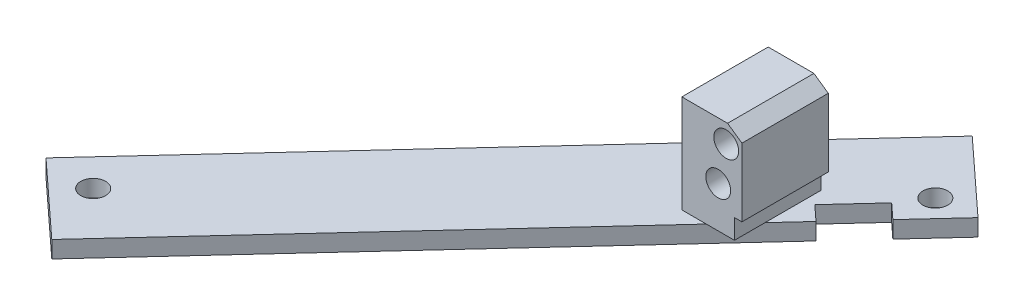
ISO-10303-21;
HEADER;
FILE_DESCRIPTION(('STEP AP214'),'2;1');
FILE_NAME('part.step','',(''),(''),'','','');
FILE_SCHEMA(('AUTOMOTIVE_DESIGN { 1 0 10303 214 1 1 1 1 }'));
ENDSEC;
DATA;
#1=APPLICATION_CONTEXT('core data for automotive mechanical design processes');
#2=APPLICATION_PROTOCOL_DEFINITION('international standard','automotive_design',2000,#1);
#3=PRODUCT_CONTEXT('',#1,'mechanical');
#4=PRODUCT('Part','Part','',(#3));
#5=PRODUCT_RELATED_PRODUCT_CATEGORY('part','',(#4));
#6=PRODUCT_DEFINITION_FORMATION('','',#4);
#7=PRODUCT_DEFINITION_CONTEXT('part definition',#1,'design');
#8=PRODUCT_DEFINITION('design','',#6,#7);
#9=PRODUCT_DEFINITION_SHAPE('','',#8);
#10=(LENGTH_UNIT() NAMED_UNIT(*) SI_UNIT(.MILLI.,.METRE.));
#11=(NAMED_UNIT(*) PLANE_ANGLE_UNIT() SI_UNIT($,.RADIAN.));
#12=(NAMED_UNIT(*) SI_UNIT($,.STERADIAN.) SOLID_ANGLE_UNIT());
#13=UNCERTAINTY_MEASURE_WITH_UNIT(LENGTH_MEASURE(1.E-05),#10,'distance_accuracy_value','');
#14=(GEOMETRIC_REPRESENTATION_CONTEXT(3) GLOBAL_UNCERTAINTY_ASSIGNED_CONTEXT((#13)) GLOBAL_UNIT_ASSIGNED_CONTEXT((#10,
#11,#12)) REPRESENTATION_CONTEXT('',''));
#15=CARTESIAN_POINT('',(0.,0.,0.));
#16=DIRECTION('',(0.,0.,1.));
#17=DIRECTION('',(1.,0.,0.));
#18=AXIS2_PLACEMENT_3D('',#15,#16,#17);
#19=CARTESIAN_POINT('',(-720.470654780454,7.18061443801632,87.1577305714658));
#20=DIRECTION('',(0.735397666391423,0.,0.677635796181141));
#21=DIRECTION('',(-0.677635796181141,0.,0.735397666391423));
#22=AXIS2_PLACEMENT_3D('',#19,#20,#21);
#23=PLANE('',#22);
#24=DIRECTION('',(0.,1.,0.));
#25=VECTOR('',#24,1.);
#26=CARTESIAN_POINT('',(-617.268339259505,193.810760244927,-24.841580013966));
#27=LINE('',#26,#25);
#28=CARTESIAN_POINT('',(-617.268339259505,200.405999999999,-24.841580013966));
#29=VERTEX_POINT('',#28);
#30=CARTESIAN_POINT('',(-617.268339259505,204.732760244927,-24.841580013966));
#31=VERTEX_POINT('',#30);
#32=EDGE_CURVE('E212',#29,#31,#27,.T.);
#33=ORIENTED_EDGE('',*,*,#32,.F.);
#34=DIRECTION('',(-0.677635796181141,0.,0.735397666391423));
#35=VECTOR('',#34,1.);
#36=CARTESIAN_POINT('',(-720.470654780454,200.406,87.1577305714655));
#37=LINE('',#36,#35);
#38=CARTESIAN_POINT('',(-606.819924792596,200.405999999999,-36.180620335858));
#39=VERTEX_POINT('',#38);
#40=EDGE_CURVE('E291',#39,#29,#37,.T.);
#41=ORIENTED_EDGE('',*,*,#40,.F.);
#42=DIRECTION('',(0.,1.,0.));
#43=VECTOR('',#42,1.);
#44=CARTESIAN_POINT('',(-606.819924792595,7.18061443801629,-36.1806203358577));
#45=LINE('',#44,#43);
#46=CARTESIAN_POINT('',(-606.819924792596,204.732760244927,-36.180620335858));
#47=VERTEX_POINT('',#46);
#48=EDGE_CURVE('E267',#39,#47,#45,.T.);
#49=ORIENTED_EDGE('',*,*,#48,.T.);
#50=DIRECTION('',(-0.677635796181141,0.,0.735397666391423));
#51=VECTOR('',#50,1.);
#52=CARTESIAN_POINT('',(-720.470654780454,204.732760244927,87.1577305714655));
#53=LINE('',#52,#51);
#54=EDGE_CURVE('E249',#47,#31,#53,.T.);
#55=ORIENTED_EDGE('',*,*,#54,.T.);
#56=EDGE_LOOP('',(#33,#41,#49,#55));
#57=FACE_BOUND('',#56,.T.);
#58=ADVANCED_FACE('F47',(#57),#23,.T.);
#59=CARTESIAN_POINT('',(-1.17427917548327E-13,204.732760244928,-2.00349036487754E-13));
#60=DIRECTION('',(0.,-1.,0.));
#61=DIRECTION('',(0.,0.,1.));
#62=AXIS2_PLACEMENT_3D('',#59,#60,#61);
#63=PLANE('',#62);
#64=CARTESIAN_POINT('',(-640.158735327476,204.732760244927,0.));
#65=VERTEX_POINT('',#64);
#66=CARTESIAN_POINT('',(-720.470654780454,204.732760244927,87.1577305714655));
#67=VERTEX_POINT('',#66);
#68=EDGE_CURVE('E254',#65,#67,#53,.T.);
#69=ORIENTED_EDGE('',*,*,#68,.F.);
#70=DIRECTION('',(-1.,0.,0.));
#71=VECTOR('',#70,1.);
#72=CARTESIAN_POINT('',(-1.17427917548327E-13,204.732760244928,0.));
#73=LINE('',#72,#71);
#74=CARTESIAN_POINT('',(-646.417262265417,204.732760244927,0.));
#75=VERTEX_POINT('',#74);
#76=EDGE_CURVE('E307',#65,#75,#73,.T.);
#77=ORIENTED_EDGE('',*,*,#76,.T.);
#78=DIRECTION('',(0.,0.,-1.));
#79=VECTOR('',#78,1.);
#80=CARTESIAN_POINT('',(-646.417262265417,204.732760244927,47.2440000000002));
#81=LINE('',#80,#79);
#82=CARTESIAN_POINT('',(-646.417262265417,204.732760244927,-22.0979999999998));
#83=VERTEX_POINT('',#82);
#84=EDGE_CURVE('E193',#75,#83,#81,.T.);
#85=ORIENTED_EDGE('',*,*,#84,.T.);
#86=DIRECTION('',(-1.,0.,0.));
#87=VECTOR('',#86,1.);
#88=CARTESIAN_POINT('',(-602.012710946733,204.732760244927,-22.0979999999998));
#89=LINE('',#88,#87);
#90=CARTESIAN_POINT('',(-632.951817258193,204.732760244927,-22.0979999999998));
#91=VERTEX_POINT('',#90);
#92=EDGE_CURVE('E275',#91,#83,#89,.T.);
#93=ORIENTED_EDGE('',*,*,#92,.F.);
#94=DIRECTION('',(0.,0.,1.));
#95=VECTOR('',#94,1.);
#96=CARTESIAN_POINT('',(-632.951817258193,204.732760244927,-22.0979999999998));
#97=LINE('',#96,#95);
#98=CARTESIAN_POINT('',(-632.951817258193,204.732760244927,-7.82123783881067));
#99=VERTEX_POINT('',#98);
#100=EDGE_CURVE('E224',#91,#99,#97,.T.);
#101=ORIENTED_EDGE('',*,*,#100,.T.);
#102=CARTESIAN_POINT('',(-626.698363279369,204.732760244927,-14.6077380337975));
#103=VERTEX_POINT('',#102);
#104=EDGE_CURVE('E253',#103,#99,#53,.T.);
#105=ORIENTED_EDGE('',*,*,#104,.F.);
#106=DIRECTION('',(-0.735397666391409,0.,-0.677635796181157));
#107=VECTOR('',#106,1.);
#108=CARTESIAN_POINT('',(-626.698363279369,204.732760244927,-14.6077380337975));
#109=LINE('',#108,#107);
#110=CARTESIAN_POINT('',(-630.568702676446,204.732760244927,-18.1740813045057));
#111=VERTEX_POINT('',#110);
#112=EDGE_CURVE('E200',#103,#111,#109,.T.);
#113=ORIENTED_EDGE('',*,*,#112,.T.);
#114=DIRECTION('',(0.677635796181146,0.,-0.735397666391419));
#115=VECTOR('',#114,1.);
#116=CARTESIAN_POINT('',(-630.568702676446,204.732760244927,-18.1740813045057));
#117=LINE('',#116,#115);
#118=CARTESIAN_POINT('',(-621.138678656582,204.732760244927,-28.4079232846741));
#119=VERTEX_POINT('',#118);
#120=EDGE_CURVE('E204',#111,#119,#117,.T.);
#121=ORIENTED_EDGE('',*,*,#120,.T.);
#122=DIRECTION('',(0.73539766639142,0.,0.677635796181144));
#123=VECTOR('',#122,1.);
#124=CARTESIAN_POINT('',(-621.138678656582,204.732760244927,-28.4079232846741));
#125=LINE('',#124,#123);
#126=EDGE_CURVE('E208',#119,#31,#125,.T.);
#127=ORIENTED_EDGE('',*,*,#126,.T.);
#128=ORIENTED_EDGE('',*,*,#54,.F.);
#129=DIRECTION('',(0.735397666391417,0.,0.677635796181148));
#130=VECTOR('',#129,1.);
#131=CARTESIAN_POINT('',(-606.819924792596,204.732760244927,-36.180620335858));
#132=LINE('',#131,#130);
#133=CARTESIAN_POINT('',(-625.633544770746,204.732760244927,-53.516522984967));
#134=VERTEX_POINT('',#133);
#135=EDGE_CURVE('E255',#134,#47,#132,.T.);
#136=ORIENTED_EDGE('',*,*,#135,.F.);
#137=DIRECTION('',(0.677635796181146,0.,-0.735397666391419));
#138=VECTOR('',#137,1.);
#139=CARTESIAN_POINT('',(-625.633544770746,204.732760244927,-53.516522984967));
#140=LINE('',#139,#138);
#141=CARTESIAN_POINT('',(-739.284274758606,204.732760244927,69.8218279223559));
#142=VERTEX_POINT('',#141);
#143=EDGE_CURVE('E258',#142,#134,#140,.T.);
#144=ORIENTED_EDGE('',*,*,#143,.F.);
#145=DIRECTION('',(-0.735397666391419,0.,-0.677635796181146));
#146=VECTOR('',#145,1.);
#147=CARTESIAN_POINT('',(-739.284274758606,204.732760244927,69.8218279223559));
#148=LINE('',#147,#146);
#149=EDGE_CURVE('E244',#67,#142,#148,.T.);
#150=ORIENTED_EDGE('',*,*,#149,.F.);
#151=EDGE_LOOP('',(#69,#77,#85,#93,#101,#105,#113,#121,#127,#128,#136,#144,#150));
#152=FACE_BOUND('',#151,.T.);
#153=CARTESIAN_POINT('',(-726.476877187304,204.732760244927,70.5585665415715));
#154=DIRECTION('',(0.,-1.,0.));
#155=DIRECTION('',(0.,0.,-1.));
#156=AXIS2_PLACEMENT_3D('',#153,#154,#155);
#157=CIRCLE('',#156,3.17500000000008);
#158=CARTESIAN_POINT('',(-726.476877187304,204.732760244927,67.3835665415714));
#159=VERTEX_POINT('',#158);
#160=EDGE_CURVE('E262',#159,#159,#157,.T.);
#161=ORIENTED_EDGE('',*,*,#160,.T.);
#162=EDGE_LOOP('',(#161));
#163=FACE_BOUND('',#162,.T.);
#164=CARTESIAN_POINT('',(-616.617520158039,204.732760244927,-35.0666277688599));
#165=DIRECTION('',(0.,-1.,0.));
#166=DIRECTION('',(0.,0.,-1.));
#167=AXIS2_PLACEMENT_3D('',#164,#165,#166);
#168=CIRCLE('',#167,3.17499999999996);
#169=CARTESIAN_POINT('',(-616.617520158039,204.732760244927,-38.2416277688598));
#170=VERTEX_POINT('',#169);
#171=EDGE_CURVE('E263',#170,#170,#168,.T.);
#172=ORIENTED_EDGE('',*,*,#171,.T.);
#173=EDGE_LOOP('',(#172));
#174=FACE_BOUND('',#173,.T.);
#175=ADVANCED_FACE('F368',(#152,#163,#174),#63,.F.);
#176=CARTESIAN_POINT('',(0.,0.,0.));
#177=DIRECTION('',(0.,0.,1.));
#178=DIRECTION('',(-1.,0.,0.));
#179=AXIS2_PLACEMENT_3D('',#176,#177,#178);
#180=PLANE('',#179);
#181=DIRECTION('',(-0.819152044288988,0.573576436351051,0.));
#182=VECTOR('',#181,1.);
#183=CARTESIAN_POINT('',(-100.850973306038,-144.030116505019,0.));
#184=LINE('',#183,#182);
#185=CARTESIAN_POINT('',(-631.043320926215,227.214561999736,0.));
#186=VERTEX_POINT('',#185);
#187=CARTESIAN_POINT('',(-634.713941760489,229.784758377805,0.));
#188=VERTEX_POINT('',#187);
#189=EDGE_CURVE('E170',#186,#188,#184,.T.);
#190=ORIENTED_EDGE('',*,*,#189,.T.);
#191=DIRECTION('',(-1.,0.,0.));
#192=VECTOR('',#191,1.);
#193=CARTESIAN_POINT('',(-646.417262265417,229.784758377805,0.));
#194=LINE('',#193,#192);
#195=CARTESIAN_POINT('',(-646.417262265417,229.784758377805,0.));
#196=VERTEX_POINT('',#195);
#197=EDGE_CURVE('E167',#188,#196,#194,.T.);
#198=ORIENTED_EDGE('',*,*,#197,.T.);
#199=DIRECTION('',(0.,-1.,0.));
#200=VECTOR('',#199,1.);
#201=CARTESIAN_POINT('',(-646.417262265417,0.,0.));
#202=LINE('',#201,#200);
#203=EDGE_CURVE('E197',#196,#75,#202,.T.);
#204=ORIENTED_EDGE('',*,*,#203,.T.);
#205=ORIENTED_EDGE('',*,*,#76,.F.);
#206=DIRECTION('',(-1.,0.,0.));
#207=VECTOR('',#206,1.);
#208=CARTESIAN_POINT('',(-632.951817258193,204.732760244927,0.));
#209=LINE('',#208,#207);
#210=CARTESIAN_POINT('',(-632.951817258193,204.732760244927,0.));
#211=VERTEX_POINT('',#210);
#212=EDGE_CURVE('E230',#211,#65,#209,.T.);
#213=ORIENTED_EDGE('',*,*,#212,.F.);
#214=DIRECTION('',(0.,-1.,0.));
#215=VECTOR('',#214,1.);
#216=CARTESIAN_POINT('',(-632.951817258193,232.176381810683,0.));
#217=LINE('',#216,#215);
#218=CARTESIAN_POINT('',(-632.951817258193,209.772926257714,0.));
#219=VERTEX_POINT('',#218);
#220=EDGE_CURVE('E234',#219,#211,#217,.T.);
#221=ORIENTED_EDGE('',*,*,#220,.F.);
#222=DIRECTION('',(1.,0.,0.));
#223=VECTOR('',#222,1.);
#224=CARTESIAN_POINT('',(-629.011320926215,209.772926257714,0.));
#225=LINE('',#224,#223);
#226=CARTESIAN_POINT('',(-631.043320926215,209.772926257714,0.));
#227=VERTEX_POINT('',#226);
#228=EDGE_CURVE('E312',#219,#227,#225,.T.);
#229=ORIENTED_EDGE('',*,*,#228,.T.);
#230=DIRECTION('',(0.,1.,0.));
#231=VECTOR('',#230,1.);
#232=CARTESIAN_POINT('',(-631.043320926215,0.,0.));
#233=LINE('',#232,#231);
#234=EDGE_CURVE('E187',#227,#186,#233,.T.);
#235=ORIENTED_EDGE('',*,*,#234,.T.);
#236=EDGE_LOOP('',(#190,#198,#204,#205,#213,#221,#229,#235));
#237=FACE_BOUND('',#236,.T.);
#238=CARTESIAN_POINT('',(-635.053635704384,224.999999999999,0.));
#239=DIRECTION('',(0.,0.,1.));
#240=DIRECTION('',(1.,0.,0.));
#241=AXIS2_PLACEMENT_3D('',#238,#239,#240);
#242=CIRCLE('',#241,3.1750000000002);
#243=CARTESIAN_POINT('',(-638.228635704384,224.999999999999,0.));
#244=VERTEX_POINT('',#243);
#245=EDGE_CURVE('E311',#244,#244,#242,.T.);
#246=ORIENTED_EDGE('',*,*,#245,.F.);
#247=EDGE_LOOP('',(#246));
#248=FACE_BOUND('',#247,.T.);
#249=CARTESIAN_POINT('',(-637.111164230449,215.21396012861,0.));
#250=DIRECTION('',(0.,0.,1.));
#251=DIRECTION('',(1.,0.,0.));
#252=AXIS2_PLACEMENT_3D('',#249,#250,#251);
#253=CIRCLE('',#252,3.17500000000009);
#254=CARTESIAN_POINT('',(-640.286164230449,215.21396012861,0.));
#255=VERTEX_POINT('',#254);
#256=EDGE_CURVE('E321',#255,#255,#253,.T.);
#257=ORIENTED_EDGE('',*,*,#256,.F.);
#258=EDGE_LOOP('',(#257));
#259=FACE_BOUND('',#258,.T.);
#260=ADVANCED_FACE('F375',(#237,#248,#259),#180,.T.);
#261=CARTESIAN_POINT('',(-602.012710946733,222.838262989788,-22.0979999999998));
#262=DIRECTION('',(0.,0.,1.));
#263=DIRECTION('',(-1.,0.,0.));
#264=AXIS2_PLACEMENT_3D('',#261,#262,#263);
#265=PLANE('',#264);
#266=CARTESIAN_POINT('',(-635.053635704384,224.999999999999,-22.0979999999998));
#267=DIRECTION('',(0.,0.,-1.));
#268=DIRECTION('',(-1.,0.,0.));
#269=AXIS2_PLACEMENT_3D('',#266,#267,#268);
#270=CIRCLE('',#269,3.1750000000002);
#271=CARTESIAN_POINT('',(-638.228635704384,224.999999999999,-22.0979999999998));
#272=VERTEX_POINT('',#271);
#273=EDGE_CURVE('E331',#272,#272,#270,.T.);
#274=ORIENTED_EDGE('',*,*,#273,.F.);
#275=EDGE_LOOP('',(#274));
#276=FACE_BOUND('',#275,.T.);
#277=CARTESIAN_POINT('',(-637.111164230449,215.21396012861,-22.0979999999998));
#278=DIRECTION('',(0.,0.,-1.));
#279=DIRECTION('',(-1.,0.,0.));
#280=AXIS2_PLACEMENT_3D('',#277,#278,#279);
#281=CIRCLE('',#280,3.17500000000009);
#282=CARTESIAN_POINT('',(-640.286164230449,215.21396012861,-22.0979999999998));
#283=VERTEX_POINT('',#282);
#284=EDGE_CURVE('E316',#283,#283,#281,.T.);
#285=ORIENTED_EDGE('',*,*,#284,.F.);
#286=EDGE_LOOP('',(#285));
#287=FACE_BOUND('',#286,.T.);
#288=DIRECTION('',(0.,-1.,0.));
#289=VECTOR('',#288,1.);
#290=CARTESIAN_POINT('',(-631.043320926215,229.784758377805,-22.0979999999998));
#291=LINE('',#290,#289);
#292=CARTESIAN_POINT('',(-631.043320926215,227.214561999736,-22.0979999999998));
#293=VERTEX_POINT('',#292);
#294=CARTESIAN_POINT('',(-631.043320926215,209.772926257714,-22.0979999999998));
#295=VERTEX_POINT('',#294);
#296=EDGE_CURVE('E458',#293,#295,#291,.T.);
#297=ORIENTED_EDGE('',*,*,#296,.T.);
#298=DIRECTION('',(-1.,0.,0.));
#299=VECTOR('',#298,1.);
#300=CARTESIAN_POINT('',(-629.011320926215,209.772926257714,-22.0979999999998));
#301=LINE('',#300,#299);
#302=CARTESIAN_POINT('',(-632.951817258193,209.772926257714,-22.0979999999998));
#303=VERTEX_POINT('',#302);
#304=EDGE_CURVE('E325',#295,#303,#301,.T.);
#305=ORIENTED_EDGE('',*,*,#304,.T.);
#306=DIRECTION('',(0.,-1.,0.));
#307=VECTOR('',#306,1.);
#308=CARTESIAN_POINT('',(-632.951817258193,232.176381810683,-22.0979999999998));
#309=LINE('',#308,#307);
#310=EDGE_CURVE('E216',#303,#91,#309,.T.);
#311=ORIENTED_EDGE('',*,*,#310,.T.);
#312=ORIENTED_EDGE('',*,*,#92,.T.);
#313=DIRECTION('',(0.,1.,0.));
#314=VECTOR('',#313,1.);
#315=CARTESIAN_POINT('',(-646.417262265417,232.174381810683,-22.0979999999998));
#316=LINE('',#315,#314);
#317=CARTESIAN_POINT('',(-646.417262265417,229.784758377805,-22.0979999999998));
#318=VERTEX_POINT('',#317);
#319=EDGE_CURVE('E180',#83,#318,#316,.T.);
#320=ORIENTED_EDGE('',*,*,#319,.T.);
#321=DIRECTION('',(1.,0.,0.));
#322=VECTOR('',#321,1.);
#323=CARTESIAN_POINT('',(-646.417262265417,229.784758377805,-22.0979999999998));
#324=LINE('',#323,#322);
#325=CARTESIAN_POINT('',(-634.713941760489,229.784758377805,-22.0979999999998));
#326=VERTEX_POINT('',#325);
#327=EDGE_CURVE('E164',#318,#326,#324,.T.);
#328=ORIENTED_EDGE('',*,*,#327,.T.);
#329=DIRECTION('',(0.819152044288988,-0.573576436351051,0.));
#330=VECTOR('',#329,1.);
#331=CARTESIAN_POINT('',(-634.713941760489,229.784758377805,-22.0979999999998));
#332=LINE('',#331,#330);
#333=EDGE_CURVE('E171',#326,#293,#332,.T.);
#334=ORIENTED_EDGE('',*,*,#333,.T.);
#335=EDGE_LOOP('',(#297,#305,#311,#312,#320,#328,#334));
#336=FACE_BOUND('',#335,.T.);
#337=ADVANCED_FACE('F49',(#276,#287,#336),#265,.F.);
#338=CARTESIAN_POINT('',(-629.011320926215,209.772926257714,-53.0414259923048));
#339=DIRECTION('',(0.,1.,0.));
#340=DIRECTION('',(0.,0.,-1.));
#341=AXIS2_PLACEMENT_3D('',#338,#339,#340);
#342=PLANE('',#341);
#343=ORIENTED_EDGE('',*,*,#228,.F.);
#344=DIRECTION('',(0.,0.,1.));
#345=VECTOR('',#344,1.);
#346=CARTESIAN_POINT('',(-632.951817258193,209.772926257714,-53.0414259923048));
#347=LINE('',#346,#345);
#348=EDGE_CURVE('E317',#303,#219,#347,.T.);
#349=ORIENTED_EDGE('',*,*,#348,.F.);
#350=ORIENTED_EDGE('',*,*,#304,.F.);
#351=DIRECTION('',(0.,0.,-1.));
#352=VECTOR('',#351,1.);
#353=CARTESIAN_POINT('',(-631.043320926215,209.772926257714,18.0340000000002));
#354=LINE('',#353,#352);
#355=EDGE_CURVE('E452',#227,#295,#354,.T.);
#356=ORIENTED_EDGE('',*,*,#355,.F.);
#357=EDGE_LOOP('',(#343,#349,#350,#356));
#358=FACE_BOUND('',#357,.T.);
#359=ADVANCED_FACE('F440',(#358),#342,.F.);
#360=CARTESIAN_POINT('',(-635.053635704384,224.999999999999,-53.0414259923048));
#361=DIRECTION('',(0.,0.,1.));
#362=DIRECTION('',(-1.,0.,0.));
#363=AXIS2_PLACEMENT_3D('',#360,#361,#362);
#364=CYLINDRICAL_SURFACE('',#363,3.1750000000002);
#365=CARTESIAN_POINT('',(-638.228635704384,224.999999999999,-22.0979999999998));
#366=CARTESIAN_POINT('',(-638.228635704384,224.999999999999,-21.8678124999998));
#367=CARTESIAN_POINT('',(-638.228635704384,224.999999999999,-21.6376249999998));
#368=CARTESIAN_POINT('',(-638.228635704384,224.999999999999,-21.1772499999998));
#369=CARTESIAN_POINT('',(-638.228635704384,224.999999999999,-20.9470624999998));
#370=CARTESIAN_POINT('',(-638.228635704384,224.999999999999,-20.4866874999998));
#371=CARTESIAN_POINT('',(-638.228635704384,224.999999999999,-20.2564999999998));
#372=CARTESIAN_POINT('',(-638.228635704384,224.999999999999,-19.7961249999998));
#373=CARTESIAN_POINT('',(-638.228635704384,224.999999999999,-19.5659374999998));
#374=CARTESIAN_POINT('',(-638.228635704384,224.999999999999,-19.1055624999998));
#375=CARTESIAN_POINT('',(-638.228635704384,224.999999999999,-18.8753749999998));
#376=CARTESIAN_POINT('',(-638.228635704384,224.999999999999,-18.4149999999998));
#377=CARTESIAN_POINT('',(-638.228635704384,224.999999999999,-18.1848124999998));
#378=CARTESIAN_POINT('',(-638.228635704384,224.999999999999,-17.7244374999998));
#379=CARTESIAN_POINT('',(-638.228635704384,224.999999999999,-17.4942499999998));
#380=CARTESIAN_POINT('',(-638.228635704384,224.999999999999,-17.0338749999998));
#381=CARTESIAN_POINT('',(-638.228635704384,224.999999999999,-16.8036874999998));
#382=CARTESIAN_POINT('',(-638.228635704384,224.999999999999,-16.3433124999998));
#383=CARTESIAN_POINT('',(-638.228635704384,224.999999999999,-16.1131249999998));
#384=CARTESIAN_POINT('',(-638.228635704384,224.999999999999,-15.6527499999998));
#385=CARTESIAN_POINT('',(-638.228635704384,224.999999999999,-15.4225624999998));
#386=CARTESIAN_POINT('',(-638.228635704384,224.999999999999,-14.9621874999998));
#387=CARTESIAN_POINT('',(-638.228635704384,224.999999999999,-14.7319999999998));
#388=CARTESIAN_POINT('',(-638.228635704384,224.999999999999,-14.2716249999998));
#389=CARTESIAN_POINT('',(-638.228635704384,224.999999999999,-14.0414374999998));
#390=CARTESIAN_POINT('',(-638.228635704384,224.999999999999,-13.5810624999999));
#391=CARTESIAN_POINT('',(-638.228635704384,224.999999999999,-13.3508749999999));
#392=CARTESIAN_POINT('',(-638.228635704384,224.999999999999,-12.8904999999999));
#393=CARTESIAN_POINT('',(-638.228635704384,224.999999999999,-12.6603124999999));
#394=CARTESIAN_POINT('',(-638.228635704384,224.999999999999,-12.1999374999999));
#395=CARTESIAN_POINT('',(-638.228635704384,224.999999999999,-11.9697499999999));
#396=CARTESIAN_POINT('',(-638.228635704384,224.999999999999,-11.5093749999999));
#397=CARTESIAN_POINT('',(-638.228635704384,224.999999999999,-11.2791874999999));
#398=CARTESIAN_POINT('',(-638.228635704384,224.999999999999,-10.8188124999999));
#399=CARTESIAN_POINT('',(-638.228635704384,224.999999999999,-10.5886249999999));
#400=CARTESIAN_POINT('',(-638.228635704384,224.999999999999,-10.1282499999999));
#401=CARTESIAN_POINT('',(-638.228635704384,224.999999999999,-9.8980624999999));
#402=CARTESIAN_POINT('',(-638.228635704384,224.999999999999,-9.4376874999999));
#403=CARTESIAN_POINT('',(-638.228635704384,224.999999999999,-9.2074999999999));
#404=CARTESIAN_POINT('',(-638.228635704384,224.999999999999,-8.74712499999991));
#405=CARTESIAN_POINT('',(-638.228635704384,224.999999999999,-8.51693749999991));
#406=CARTESIAN_POINT('',(-638.228635704384,224.999999999999,-8.05656249999991));
#407=CARTESIAN_POINT('',(-638.228635704384,224.999999999999,-7.82637499999992));
#408=CARTESIAN_POINT('',(-638.228635704384,224.999999999999,-7.36599999999992));
#409=CARTESIAN_POINT('',(-638.228635704384,224.999999999999,-7.13581249999993));
#410=CARTESIAN_POINT('',(-638.228635704384,224.999999999999,-6.67543749999993));
#411=CARTESIAN_POINT('',(-638.228635704384,224.999999999999,-6.44524999999993));
#412=CARTESIAN_POINT('',(-638.228635704384,224.999999999999,-5.98487499999994));
#413=CARTESIAN_POINT('',(-638.228635704384,224.999999999999,-5.75468749999994));
#414=CARTESIAN_POINT('',(-638.228635704384,224.999999999999,-5.29431249999995));
#415=CARTESIAN_POINT('',(-638.228635704384,224.999999999999,-5.06412499999995));
#416=CARTESIAN_POINT('',(-638.228635704384,224.999999999999,-4.60374999999995));
#417=CARTESIAN_POINT('',(-638.228635704384,224.999999999999,-4.37356249999995));
#418=CARTESIAN_POINT('',(-638.228635704384,224.999999999999,-3.91318749999996));
#419=CARTESIAN_POINT('',(-638.228635704384,224.999999999999,-3.68299999999996));
#420=CARTESIAN_POINT('',(-638.228635704384,224.999999999999,-3.22262499999997));
#421=CARTESIAN_POINT('',(-638.228635704384,224.999999999999,-2.99243749999997));
#422=CARTESIAN_POINT('',(-638.228635704384,224.999999999999,-2.53206249999998));
#423=CARTESIAN_POINT('',(-638.228635704384,224.999999999999,-2.30187499999998));
#424=CARTESIAN_POINT('',(-638.228635704384,224.999999999999,-1.84149999999998));
#425=CARTESIAN_POINT('',(-638.228635704384,224.999999999999,-1.61131249999999));
#426=CARTESIAN_POINT('',(-638.228635704384,224.999999999999,-1.15093749999999));
#427=CARTESIAN_POINT('',(-638.228635704384,224.999999999999,-0.920749999999996));
#428=CARTESIAN_POINT('',(-638.228635704384,224.999999999999,-0.460375000000001));
#429=CARTESIAN_POINT('',(-638.228635704384,224.999999999999,-0.230187500000004));
#430=CARTESIAN_POINT('',(-638.228635704384,224.999999999999,0.));
#431=B_SPLINE_CURVE_WITH_KNOTS('',3,(#365,#366,#367,#368,#369,#370,#371,#372,#373,#374,#375,
#376,#377,#378,#379,#380,#381,#382,#383,#384,#385,#386,#387,#388,#389,#390,#391,#392,#393,#394,
#395,#396,#397,#398,#399,#400,#401,#402,#403,#404,#405,#406,#407,#408,#409,#410,#411,#412,#413,
#414,#415,#416,#417,#418,#419,#420,#421,#422,#423,#424,#425,#426,#427,#428,#429,#430),
.UNSPECIFIED.,.F.,.F.,(4,2,2,2,2,2,2,2,2,2,2,2,2,2,2,2,2,2,2,2,2,2,2,2,2,2,2,2,2,2,2,2,4),(0.,
0.690562499999988,1.38112499999998,2.07168749999997,2.76224999999996,3.45281249999996,
4.14337499999995,4.83393749999994,5.52449999999994,6.21506249999993,6.90562499999992,
7.59618749999991,8.2867499999999,8.97731249999989,9.66787499999988,10.3584374999999,
11.0489999999999,11.7395624999999,12.4301249999999,13.1206874999998,13.8112499999998,
14.5018124999998,15.1923749999998,15.8829374999998,16.5734999999998,17.2640624999998,
17.9546249999998,18.6451874999998,19.3357499999998,20.0263124999998,20.7168749999998,
21.4074374999998,22.0979999999997),.UNSPECIFIED.);
#432=EDGE_CURVE('BSEAM422',#272,#244,#431,.T.);
#433=ORIENTED_EDGE('',*,*,#273,.T.);
#434=ORIENTED_EDGE('',*,*,#245,.T.);
#435=ORIENTED_EDGE('',*,*,#432,.T.);
#436=ORIENTED_EDGE('',*,*,#432,.F.);
#437=EDGE_LOOP('',(#433,#435,#434,#436));
#438=FACE_BOUND('',#437,.T.);
#439=ADVANCED_FACE('F422',(#438),#364,.F.);
#440=CARTESIAN_POINT('',(-637.111164230449,215.21396012861,-53.0414259923048));
#441=DIRECTION('',(0.,0.,1.));
#442=DIRECTION('',(-1.,0.,0.));
#443=AXIS2_PLACEMENT_3D('',#440,#441,#442);
#444=CYLINDRICAL_SURFACE('',#443,3.17500000000009);
#445=CARTESIAN_POINT('',(-640.286164230449,215.21396012861,-22.0979999999998));
#446=CARTESIAN_POINT('',(-640.286164230449,215.21396012861,-21.8678124999998));
#447=CARTESIAN_POINT('',(-640.286164230449,215.21396012861,-21.6376249999998));
#448=CARTESIAN_POINT('',(-640.286164230449,215.21396012861,-21.1772499999998));
#449=CARTESIAN_POINT('',(-640.286164230449,215.21396012861,-20.9470624999998));
#450=CARTESIAN_POINT('',(-640.286164230449,215.21396012861,-20.4866874999998));
#451=CARTESIAN_POINT('',(-640.286164230449,215.21396012861,-20.2564999999998));
#452=CARTESIAN_POINT('',(-640.286164230449,215.21396012861,-19.7961249999998));
#453=CARTESIAN_POINT('',(-640.286164230449,215.21396012861,-19.5659374999998));
#454=CARTESIAN_POINT('',(-640.286164230449,215.21396012861,-19.1055624999998));
#455=CARTESIAN_POINT('',(-640.286164230449,215.21396012861,-18.8753749999998));
#456=CARTESIAN_POINT('',(-640.286164230449,215.21396012861,-18.4149999999998));
#457=CARTESIAN_POINT('',(-640.286164230449,215.21396012861,-18.1848124999998));
#458=CARTESIAN_POINT('',(-640.286164230449,215.21396012861,-17.7244374999998));
#459=CARTESIAN_POINT('',(-640.286164230449,215.21396012861,-17.4942499999998));
#460=CARTESIAN_POINT('',(-640.286164230449,215.21396012861,-17.0338749999998));
#461=CARTESIAN_POINT('',(-640.286164230449,215.21396012861,-16.8036874999998));
#462=CARTESIAN_POINT('',(-640.286164230449,215.21396012861,-16.3433124999998));
#463=CARTESIAN_POINT('',(-640.286164230449,215.21396012861,-16.1131249999998));
#464=CARTESIAN_POINT('',(-640.286164230449,215.21396012861,-15.6527499999998));
#465=CARTESIAN_POINT('',(-640.286164230449,215.21396012861,-15.4225624999998));
#466=CARTESIAN_POINT('',(-640.286164230449,215.21396012861,-14.9621874999998));
#467=CARTESIAN_POINT('',(-640.286164230449,215.21396012861,-14.7319999999998));
#468=CARTESIAN_POINT('',(-640.286164230449,215.21396012861,-14.2716249999998));
#469=CARTESIAN_POINT('',(-640.286164230449,215.21396012861,-14.0414374999998));
#470=CARTESIAN_POINT('',(-640.286164230449,215.21396012861,-13.5810624999999));
#471=CARTESIAN_POINT('',(-640.286164230449,215.21396012861,-13.3508749999999));
#472=CARTESIAN_POINT('',(-640.286164230449,215.21396012861,-12.8904999999999));
#473=CARTESIAN_POINT('',(-640.286164230449,215.21396012861,-12.6603124999999));
#474=CARTESIAN_POINT('',(-640.286164230449,215.21396012861,-12.1999374999999));
#475=CARTESIAN_POINT('',(-640.286164230449,215.21396012861,-11.9697499999999));
#476=CARTESIAN_POINT('',(-640.286164230449,215.21396012861,-11.5093749999999));
#477=CARTESIAN_POINT('',(-640.286164230449,215.21396012861,-11.2791874999999));
#478=CARTESIAN_POINT('',(-640.286164230449,215.21396012861,-10.8188124999999));
#479=CARTESIAN_POINT('',(-640.286164230449,215.21396012861,-10.5886249999999));
#480=CARTESIAN_POINT('',(-640.286164230449,215.21396012861,-10.1282499999999));
#481=CARTESIAN_POINT('',(-640.286164230449,215.21396012861,-9.8980624999999));
#482=CARTESIAN_POINT('',(-640.286164230449,215.21396012861,-9.4376874999999));
#483=CARTESIAN_POINT('',(-640.286164230449,215.21396012861,-9.2074999999999));
#484=CARTESIAN_POINT('',(-640.286164230449,215.21396012861,-8.74712499999991));
#485=CARTESIAN_POINT('',(-640.286164230449,215.21396012861,-8.51693749999991));
#486=CARTESIAN_POINT('',(-640.286164230449,215.21396012861,-8.05656249999991));
#487=CARTESIAN_POINT('',(-640.286164230449,215.21396012861,-7.82637499999992));
#488=CARTESIAN_POINT('',(-640.286164230449,215.21396012861,-7.36599999999992));
#489=CARTESIAN_POINT('',(-640.286164230449,215.21396012861,-7.13581249999993));
#490=CARTESIAN_POINT('',(-640.286164230449,215.21396012861,-6.67543749999993));
#491=CARTESIAN_POINT('',(-640.286164230449,215.21396012861,-6.44524999999993));
#492=CARTESIAN_POINT('',(-640.286164230449,215.21396012861,-5.98487499999994));
#493=CARTESIAN_POINT('',(-640.286164230449,215.21396012861,-5.75468749999994));
#494=CARTESIAN_POINT('',(-640.286164230449,215.21396012861,-5.29431249999995));
#495=CARTESIAN_POINT('',(-640.286164230449,215.21396012861,-5.06412499999995));
#496=CARTESIAN_POINT('',(-640.286164230449,215.21396012861,-4.60374999999995));
#497=CARTESIAN_POINT('',(-640.286164230449,215.21396012861,-4.37356249999995));
#498=CARTESIAN_POINT('',(-640.286164230449,215.21396012861,-3.91318749999996));
#499=CARTESIAN_POINT('',(-640.286164230449,215.21396012861,-3.68299999999996));
#500=CARTESIAN_POINT('',(-640.286164230449,215.21396012861,-3.22262499999997));
#501=CARTESIAN_POINT('',(-640.286164230449,215.21396012861,-2.99243749999997));
#502=CARTESIAN_POINT('',(-640.286164230449,215.21396012861,-2.53206249999998));
#503=CARTESIAN_POINT('',(-640.286164230449,215.21396012861,-2.30187499999998));
#504=CARTESIAN_POINT('',(-640.286164230449,215.21396012861,-1.84149999999998));
#505=CARTESIAN_POINT('',(-640.286164230449,215.21396012861,-1.61131249999999));
#506=CARTESIAN_POINT('',(-640.286164230449,215.21396012861,-1.15093749999999));
#507=CARTESIAN_POINT('',(-640.286164230449,215.21396012861,-0.920749999999996));
#508=CARTESIAN_POINT('',(-640.286164230449,215.21396012861,-0.460375000000001));
#509=CARTESIAN_POINT('',(-640.286164230449,215.21396012861,-0.230187500000004));
#510=CARTESIAN_POINT('',(-640.286164230449,215.21396012861,0.));
#511=B_SPLINE_CURVE_WITH_KNOTS('',3,(#445,#446,#447,#448,#449,#450,#451,#452,#453,#454,#455,
#456,#457,#458,#459,#460,#461,#462,#463,#464,#465,#466,#467,#468,#469,#470,#471,#472,#473,#474,
#475,#476,#477,#478,#479,#480,#481,#482,#483,#484,#485,#486,#487,#488,#489,#490,#491,#492,#493,
#494,#495,#496,#497,#498,#499,#500,#501,#502,#503,#504,#505,#506,#507,#508,#509,#510),
.UNSPECIFIED.,.F.,.F.,(4,2,2,2,2,2,2,2,2,2,2,2,2,2,2,2,2,2,2,2,2,2,2,2,2,2,2,2,2,2,2,2,4),(0.,
0.690562499999988,1.38112499999998,2.07168749999997,2.76224999999996,3.45281249999996,
4.14337499999995,4.83393749999994,5.52449999999994,6.21506249999993,6.90562499999992,
7.59618749999991,8.2867499999999,8.97731249999989,9.66787499999988,10.3584374999999,
11.0489999999999,11.7395624999999,12.4301249999999,13.1206874999998,13.8112499999998,
14.5018124999998,15.1923749999998,15.8829374999998,16.5734999999998,17.2640624999998,
17.9546249999998,18.6451874999998,19.3357499999998,20.0263124999998,20.7168749999998,
21.4074374999998,22.0979999999997),.UNSPECIFIED.);
#512=EDGE_CURVE('BSEAM417',#283,#255,#511,.T.);
#513=ORIENTED_EDGE('',*,*,#284,.T.);
#514=ORIENTED_EDGE('',*,*,#256,.T.);
#515=ORIENTED_EDGE('',*,*,#512,.T.);
#516=ORIENTED_EDGE('',*,*,#512,.F.);
#517=EDGE_LOOP('',(#513,#515,#514,#516));
#518=FACE_BOUND('',#517,.T.);
#519=ADVANCED_FACE('F417',(#518),#444,.F.);
#520=CARTESIAN_POINT('',(-625.633544770746,7.18061443801624,-53.5165229849667));
#521=DIRECTION('',(-0.735397666391419,0.,-0.677635796181146));
#522=DIRECTION('',(0.677635796181146,0.,-0.735397666391419));
#523=AXIS2_PLACEMENT_3D('',#520,#521,#522);
#524=PLANE('',#523);
#525=DIRECTION('',(0.,1.,0.));
#526=VECTOR('',#525,1.);
#527=CARTESIAN_POINT('',(-739.284274758605,7.18061443801629,69.8218279223562));
#528=LINE('',#527,#526);
#529=CARTESIAN_POINT('',(-739.284274758606,200.405999999999,69.8218279223559));
#530=VERTEX_POINT('',#529);
#531=EDGE_CURVE('E290',#530,#142,#528,.T.);
#532=ORIENTED_EDGE('',*,*,#531,.T.);
#533=ORIENTED_EDGE('',*,*,#143,.T.);
#534=DIRECTION('',(0.,1.,0.));
#535=VECTOR('',#534,1.);
#536=CARTESIAN_POINT('',(-625.633544770746,7.18061443801624,-53.5165229849667));
#537=LINE('',#536,#535);
#538=CARTESIAN_POINT('',(-625.633544770746,200.405999999999,-53.516522984967));
#539=VERTEX_POINT('',#538);
#540=EDGE_CURVE('E286',#539,#134,#537,.T.);
#541=ORIENTED_EDGE('',*,*,#540,.F.);
#542=DIRECTION('',(0.677635796181146,0.,-0.735397666391419));
#543=VECTOR('',#542,1.);
#544=CARTESIAN_POINT('',(-625.633544770746,200.405999999999,-53.516522984967));
#545=LINE('',#544,#543);
#546=EDGE_CURVE('E243',#530,#539,#545,.T.);
#547=ORIENTED_EDGE('',*,*,#546,.F.);
#548=EDGE_LOOP('',(#532,#533,#541,#547));
#549=FACE_BOUND('',#548,.T.);
#550=ADVANCED_FACE('F390',(#549),#524,.T.);
#551=CARTESIAN_POINT('',(-739.284274758605,7.18061443801629,69.8218279223562));
#552=DIRECTION('',(-0.677635796181146,0.,0.735397666391419));
#553=DIRECTION('',(-0.735397666391419,0.,-0.677635796181146));
#554=AXIS2_PLACEMENT_3D('',#551,#552,#553);
#555=PLANE('',#554);
#556=DIRECTION('',(0.,1.,0.));
#557=VECTOR('',#556,1.);
#558=CARTESIAN_POINT('',(-720.470654780454,7.18061443801632,87.1577305714658));
#559=LINE('',#558,#557);
#560=CARTESIAN_POINT('',(-720.470654780455,200.406,87.1577305714658));
#561=VERTEX_POINT('',#560);
#562=EDGE_CURVE('E282',#561,#67,#559,.T.);
#563=ORIENTED_EDGE('',*,*,#562,.T.);
#564=ORIENTED_EDGE('',*,*,#149,.T.);
#565=ORIENTED_EDGE('',*,*,#531,.F.);
#566=DIRECTION('',(-0.735397666391419,0.,-0.677635796181146));
#567=VECTOR('',#566,1.);
#568=CARTESIAN_POINT('',(-739.284274758606,200.405999999999,69.8218279223559));
#569=LINE('',#568,#567);
#570=EDGE_CURVE('E287',#561,#530,#569,.T.);
#571=ORIENTED_EDGE('',*,*,#570,.F.);
#572=EDGE_LOOP('',(#563,#564,#565,#571));
#573=FACE_BOUND('',#572,.T.);
#574=ADVANCED_FACE('F382',(#573),#555,.T.);
#575=DIRECTION('',(0.,1.,0.));
#576=VECTOR('',#575,1.);
#577=CARTESIAN_POINT('',(-626.698363279369,193.810760244927,-14.6077380337975));
#578=LINE('',#577,#576);
#579=CARTESIAN_POINT('',(-626.698363279369,200.405999999999,-14.6077380337975));
#580=VERTEX_POINT('',#579);
#581=EDGE_CURVE('E211',#580,#103,#578,.T.);
#582=ORIENTED_EDGE('',*,*,#581,.T.);
#583=ORIENTED_EDGE('',*,*,#104,.T.);
#584=DIRECTION('',(0.677635796181141,0.,-0.735397666391423));
#585=VECTOR('',#584,1.);
#586=CARTESIAN_POINT('',(-720.470654780455,204.732760244927,87.1577305714656));
#587=LINE('',#586,#585);
#588=EDGE_CURVE('E228',#65,#99,#587,.T.);
#589=ORIENTED_EDGE('',*,*,#588,.F.);
#590=ORIENTED_EDGE('',*,*,#68,.T.);
#591=ORIENTED_EDGE('',*,*,#562,.F.);
#592=EDGE_CURVE('E295',#580,#561,#37,.T.);
#593=ORIENTED_EDGE('',*,*,#592,.F.);
#594=EDGE_LOOP('',(#582,#583,#589,#590,#591,#593));
#595=FACE_BOUND('',#594,.T.);
#596=ADVANCED_FACE('F371',(#595),#23,.T.);
#597=CARTESIAN_POINT('',(-606.819924792595,7.18061443801629,-36.1806203358577));
#598=DIRECTION('',(0.677635796181148,0.,-0.735397666391417));
#599=DIRECTION('',(0.735397666391417,0.,0.677635796181148));
#600=AXIS2_PLACEMENT_3D('',#597,#598,#599);
#601=PLANE('',#600);
#602=ORIENTED_EDGE('',*,*,#540,.T.);
#603=ORIENTED_EDGE('',*,*,#135,.T.);
#604=ORIENTED_EDGE('',*,*,#48,.F.);
#605=DIRECTION('',(0.735397666391417,0.,0.677635796181148));
#606=VECTOR('',#605,1.);
#607=CARTESIAN_POINT('',(-606.819924792596,200.405999999999,-36.180620335858));
#608=LINE('',#607,#606);
#609=EDGE_CURVE('E279',#539,#39,#608,.T.);
#610=ORIENTED_EDGE('',*,*,#609,.F.);
#611=EDGE_LOOP('',(#602,#603,#604,#610));
#612=FACE_BOUND('',#611,.T.);
#613=ADVANCED_FACE('F381',(#612),#601,.T.);
#614=CARTESIAN_POINT('',(-616.617520158039,7.18061443801626,-35.0666277688596));
#615=DIRECTION('',(0.,1.,0.));
#616=DIRECTION('',(0.,0.,-1.));
#617=AXIS2_PLACEMENT_3D('',#614,#615,#616);
#618=CYLINDRICAL_SURFACE('',#617,3.17499999999996);
#619=ORIENTED_EDGE('',*,*,#171,.F.);
#620=EDGE_LOOP('',(#619));
#621=FACE_BOUND('',#620,.T.);
#622=CARTESIAN_POINT('',(-616.617520158039,200.405999999999,-35.0666277688599));
#623=DIRECTION('',(0.,1.,0.));
#624=DIRECTION('',(0.,0.,1.));
#625=AXIS2_PLACEMENT_3D('',#622,#623,#624);
#626=CIRCLE('',#625,3.17499999999996);
#627=CARTESIAN_POINT('',(-616.617520158039,200.405999999999,-31.8916277688599));
#628=VERTEX_POINT('',#627);
#629=EDGE_CURVE('E271',#628,#628,#626,.F.);
#630=ORIENTED_EDGE('',*,*,#629,.T.);
#631=EDGE_LOOP('',(#630));
#632=FACE_BOUND('',#631,.T.);
#633=ADVANCED_FACE('F388',(#621,#632),#618,.F.);
#634=CARTESIAN_POINT('',(-726.476877187304,7.18061443801629,70.5585665415718));
#635=DIRECTION('',(0.,1.,0.));
#636=DIRECTION('',(0.,0.,-1.));
#637=AXIS2_PLACEMENT_3D('',#634,#635,#636);
#638=CYLINDRICAL_SURFACE('',#637,3.17500000000008);
#639=ORIENTED_EDGE('',*,*,#160,.F.);
#640=EDGE_LOOP('',(#639));
#641=FACE_BOUND('',#640,.T.);
#642=CARTESIAN_POINT('',(-726.476877187304,200.405999999999,70.5585665415715));
#643=DIRECTION('',(0.,1.,0.));
#644=DIRECTION('',(0.,0.,1.));
#645=AXIS2_PLACEMENT_3D('',#642,#643,#644);
#646=CIRCLE('',#645,3.17500000000008);
#647=CARTESIAN_POINT('',(-726.476877187304,200.405999999999,73.7335665415716));
#648=VERTEX_POINT('',#647);
#649=EDGE_CURVE('E248',#648,#648,#646,.F.);
#650=ORIENTED_EDGE('',*,*,#649,.T.);
#651=EDGE_LOOP('',(#650));
#652=FACE_BOUND('',#651,.T.);
#653=ADVANCED_FACE('F427',(#641,#652),#638,.F.);
#654=CARTESIAN_POINT('',(-616.617520158039,200.405999999999,-35.0666277688596));
#655=DIRECTION('',(0.,-1.,0.));
#656=DIRECTION('',(0.224407996125969,0.,-0.974495280273192));
#657=AXIS2_PLACEMENT_3D('',#654,#655,#656);
#658=PLANE('',#657);
#659=DIRECTION('',(-0.73539766639142,0.,-0.677635796181144));
#660=VECTOR('',#659,1.);
#661=CARTESIAN_POINT('',(-622.011836239182,200.405999999999,-29.2124986331111));
#662=LINE('',#661,#660);
#663=CARTESIAN_POINT('',(-621.138678656582,200.405999999999,-28.4079232846741));
#664=VERTEX_POINT('',#663);
#665=EDGE_CURVE('E56',#29,#664,#662,.T.);
#666=ORIENTED_EDGE('',*,*,#665,.T.);
#667=DIRECTION('',(-0.677635796181146,0.,0.735397666391419));
#668=VECTOR('',#667,1.);
#669=CARTESIAN_POINT('',(-615.744362575439,200.405999999999,-34.2620524204226));
#670=LINE('',#669,#668);
#671=CARTESIAN_POINT('',(-630.568702676446,200.405999999999,-18.1740813045057));
#672=VERTEX_POINT('',#671);
#673=EDGE_CURVE('E341',#664,#672,#670,.T.);
#674=ORIENTED_EDGE('',*,*,#673,.T.);
#675=DIRECTION('',(0.735397666391409,0.,0.677635796181157));
#676=VECTOR('',#675,1.);
#677=CARTESIAN_POINT('',(-631.441860259046,200.405999999999,-18.9786566529429));
#678=LINE('',#677,#676);
#679=EDGE_CURVE('E335',#672,#580,#678,.T.);
#680=ORIENTED_EDGE('',*,*,#679,.T.);
#681=ORIENTED_EDGE('',*,*,#592,.T.);
#682=ORIENTED_EDGE('',*,*,#570,.T.);
#683=ORIENTED_EDGE('',*,*,#546,.T.);
#684=ORIENTED_EDGE('',*,*,#609,.T.);
#685=ORIENTED_EDGE('',*,*,#40,.T.);
#686=EDGE_LOOP('',(#666,#674,#680,#681,#682,#683,#684,#685));
#687=FACE_BOUND('',#686,.T.);
#688=ORIENTED_EDGE('',*,*,#649,.F.);
#689=EDGE_LOOP('',(#688));
#690=FACE_BOUND('',#689,.T.);
#691=ORIENTED_EDGE('',*,*,#629,.F.);
#692=EDGE_LOOP('',(#691));
#693=FACE_BOUND('',#692,.T.);
#694=ADVANCED_FACE('F347',(#687,#690,#693),#658,.T.);
#695=CARTESIAN_POINT('',(-632.951817258193,232.176381810683,-22.0979999999998));
#696=DIRECTION('',(-1.,0.,0.));
#697=DIRECTION('',(0.,-1.,0.));
#698=AXIS2_PLACEMENT_3D('',#695,#696,#697);
#699=PLANE('',#698);
#700=ORIENTED_EDGE('',*,*,#348,.T.);
#701=ORIENTED_EDGE('',*,*,#220,.T.);
#702=EDGE_CURVE('E229',#99,#211,#97,.T.);
#703=ORIENTED_EDGE('',*,*,#702,.F.);
#704=ORIENTED_EDGE('',*,*,#100,.F.);
#705=ORIENTED_EDGE('',*,*,#310,.F.);
#706=EDGE_LOOP('',(#700,#701,#703,#704,#705));
#707=FACE_BOUND('',#706,.T.);
#708=ADVANCED_FACE('F434',(#707),#699,.F.);
#709=CARTESIAN_POINT('',(-5.08383175639331E-13,204.732760244929,-2.57148864511476E-13));
#710=DIRECTION('',(0.,1.,0.));
#711=DIRECTION('',(-1.,0.,0.));
#712=AXIS2_PLACEMENT_3D('',#709,#710,#711);
#713=PLANE('',#712);
#714=ORIENTED_EDGE('',*,*,#588,.T.);
#715=ORIENTED_EDGE('',*,*,#702,.T.);
#716=ORIENTED_EDGE('',*,*,#212,.T.);
#717=EDGE_LOOP('',(#714,#715,#716));
#718=FACE_BOUND('',#717,.T.);
#719=ADVANCED_FACE('F365',(#718),#713,.F.);
#720=CARTESIAN_POINT('',(-621.138678656582,193.810760244927,-28.4079232846741));
#721=DIRECTION('',(0.677635796181144,0.,-0.73539766639142));
#722=DIRECTION('',(0.73539766639142,0.,0.677635796181144));
#723=AXIS2_PLACEMENT_3D('',#720,#721,#722);
#724=PLANE('',#723);
#725=ORIENTED_EDGE('',*,*,#665,.F.);
#726=ORIENTED_EDGE('',*,*,#32,.T.);
#727=ORIENTED_EDGE('',*,*,#126,.F.);
#728=DIRECTION('',(0.,1.,0.));
#729=VECTOR('',#728,1.);
#730=CARTESIAN_POINT('',(-621.138678656582,193.810760244927,-28.4079232846741));
#731=LINE('',#730,#729);
#732=EDGE_CURVE('E217',#664,#119,#731,.T.);
#733=ORIENTED_EDGE('',*,*,#732,.F.);
#734=EDGE_LOOP('',(#725,#726,#727,#733));
#735=FACE_BOUND('',#734,.T.);
#736=ADVANCED_FACE('F352',(#735),#724,.F.);
#737=CARTESIAN_POINT('',(-630.568702676446,193.810760244927,-18.1740813045057));
#738=DIRECTION('',(-0.735397666391419,0.,-0.677635796181146));
#739=DIRECTION('',(0.677635796181146,0.,-0.735397666391419));
#740=AXIS2_PLACEMENT_3D('',#737,#738,#739);
#741=PLANE('',#740);
#742=ORIENTED_EDGE('',*,*,#673,.F.);
#743=ORIENTED_EDGE('',*,*,#732,.T.);
#744=ORIENTED_EDGE('',*,*,#120,.F.);
#745=DIRECTION('',(0.,1.,0.));
#746=VECTOR('',#745,1.);
#747=CARTESIAN_POINT('',(-630.568702676446,193.810760244927,-18.1740813045057));
#748=LINE('',#747,#746);
#749=EDGE_CURVE('E69',#672,#111,#748,.T.);
#750=ORIENTED_EDGE('',*,*,#749,.F.);
#751=EDGE_LOOP('',(#742,#743,#744,#750));
#752=FACE_BOUND('',#751,.T.);
#753=ADVANCED_FACE('F354',(#752),#741,.F.);
#754=CARTESIAN_POINT('',(-626.698363279369,193.810760244927,-14.6077380337975));
#755=DIRECTION('',(-0.677635796181156,0.,0.735397666391409));
#756=DIRECTION('',(-0.735397666391409,0.,-0.677635796181157));
#757=AXIS2_PLACEMENT_3D('',#754,#755,#756);
#758=PLANE('',#757);
#759=ORIENTED_EDGE('',*,*,#679,.F.);
#760=ORIENTED_EDGE('',*,*,#749,.T.);
#761=ORIENTED_EDGE('',*,*,#112,.F.);
#762=ORIENTED_EDGE('',*,*,#581,.F.);
#763=EDGE_LOOP('',(#759,#760,#761,#762));
#764=FACE_BOUND('',#763,.T.);
#765=ADVANCED_FACE('F356',(#764),#758,.F.);
#766=CARTESIAN_POINT('',(-646.417262265417,232.174381810683,47.2440000000002));
#767=DIRECTION('',(1.,0.,0.));
#768=DIRECTION('',(0.,0.,1.));
#769=AXIS2_PLACEMENT_3D('',#766,#767,#768);
#770=PLANE('',#769);
#771=ORIENTED_EDGE('',*,*,#319,.F.);
#772=ORIENTED_EDGE('',*,*,#84,.F.);
#773=ORIENTED_EDGE('',*,*,#203,.F.);
#774=DIRECTION('',(0.,0.,-1.));
#775=VECTOR('',#774,1.);
#776=CARTESIAN_POINT('',(-646.417262265417,229.784758377805,0.));
#777=LINE('',#776,#775);
#778=EDGE_CURVE('E182',#196,#318,#777,.T.);
#779=ORIENTED_EDGE('',*,*,#778,.T.);
#780=EDGE_LOOP('',(#771,#772,#773,#779));
#781=FACE_BOUND('',#780,.T.);
#782=ADVANCED_FACE('F362',(#781),#770,.F.);
#783=CARTESIAN_POINT('',(0.,229.784758377805,0.));
#784=DIRECTION('',(0.,1.,0.));
#785=DIRECTION('',(0.,0.,-1.));
#786=AXIS2_PLACEMENT_3D('',#783,#784,#785);
#787=PLANE('',#786);
#788=DIRECTION('',(0.,0.,-1.));
#789=VECTOR('',#788,1.);
#790=CARTESIAN_POINT('',(-634.713941760489,229.784758377805,18.0340000000002));
#791=LINE('',#790,#789);
#792=EDGE_CURVE('E161',#188,#326,#791,.T.);
#793=ORIENTED_EDGE('',*,*,#792,.T.);
#794=ORIENTED_EDGE('',*,*,#327,.F.);
#795=ORIENTED_EDGE('',*,*,#778,.F.);
#796=ORIENTED_EDGE('',*,*,#197,.F.);
#797=EDGE_LOOP('',(#793,#794,#795,#796));
#798=FACE_BOUND('',#797,.T.);
#799=ADVANCED_FACE('F162',(#798),#787,.T.);
#800=CARTESIAN_POINT('',(-631.043320926215,229.784758377805,18.0340000000002));
#801=DIRECTION('',(-1.,0.,0.));
#802=DIRECTION('',(0.,0.,-1.));
#803=AXIS2_PLACEMENT_3D('',#800,#801,#802);
#804=PLANE('',#803);
#805=ORIENTED_EDGE('',*,*,#234,.F.);
#806=ORIENTED_EDGE('',*,*,#355,.T.);
#807=ORIENTED_EDGE('',*,*,#296,.F.);
#808=DIRECTION('',(0.,0.,-1.));
#809=VECTOR('',#808,1.);
#810=CARTESIAN_POINT('',(-631.043320926215,227.214561999736,18.0340000000002));
#811=LINE('',#810,#809);
#812=EDGE_CURVE('E11',#186,#293,#811,.T.);
#813=ORIENTED_EDGE('',*,*,#812,.F.);
#814=EDGE_LOOP('',(#805,#806,#807,#813));
#815=FACE_BOUND('',#814,.T.);
#816=ADVANCED_FACE('F467',(#815),#804,.F.);
#817=CARTESIAN_POINT('',(-634.713941760489,229.784758377805,18.0340000000002));
#818=DIRECTION('',(-0.573576436351051,-0.819152044288988,0.));
#819=DIRECTION('',(0.819152044288988,-0.573576436351051,0.));
#820=AXIS2_PLACEMENT_3D('',#817,#818,#819);
#821=PLANE('',#820);
#822=ORIENTED_EDGE('',*,*,#189,.F.);
#823=ORIENTED_EDGE('',*,*,#812,.T.);
#824=ORIENTED_EDGE('',*,*,#333,.F.);
#825=ORIENTED_EDGE('',*,*,#792,.F.);
#826=EDGE_LOOP('',(#822,#823,#824,#825));
#827=FACE_BOUND('',#826,.T.);
#828=ADVANCED_FACE('F173',(#827),#821,.F.);
#829=CLOSED_SHELL('',(#58,#175,#260,#337,#359,#439,#519,#550,#574,#596,#613,#633,#653,#694,#708,
#719,#736,#753,#765,#782,#799,#816,#828));
#830=MANIFOLD_SOLID_BREP('B2',#829);
#831=ADVANCED_BREP_SHAPE_REPRESENTATION('',(#18,#830),#14);
#832=SHAPE_DEFINITION_REPRESENTATION(#9,#831);
ENDSEC;
END-ISO-10303-21;
